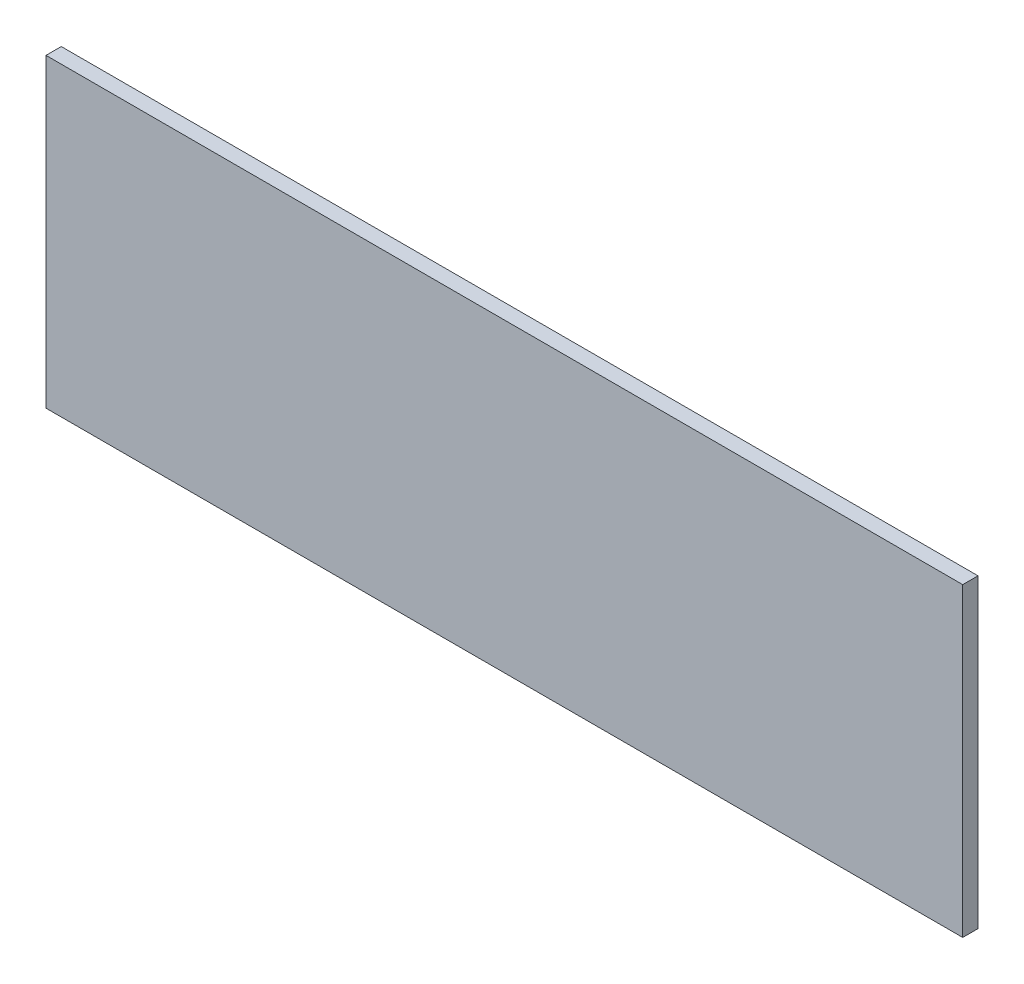
ISO-10303-21;
HEADER;
FILE_DESCRIPTION(('STEP AP214'),'2;1');
FILE_NAME('part.step','',(''),(''),'','','');
FILE_SCHEMA(('AUTOMOTIVE_DESIGN { 1 0 10303 214 1 1 1 1 }'));
ENDSEC;
DATA;
#1=APPLICATION_CONTEXT('core data for automotive mechanical design processes');
#2=APPLICATION_PROTOCOL_DEFINITION('international standard','automotive_design',2000,#1);
#3=PRODUCT_CONTEXT('',#1,'mechanical');
#4=PRODUCT('Part','Part','',(#3));
#5=PRODUCT_RELATED_PRODUCT_CATEGORY('part','',(#4));
#6=PRODUCT_DEFINITION_FORMATION('','',#4);
#7=PRODUCT_DEFINITION_CONTEXT('part definition',#1,'design');
#8=PRODUCT_DEFINITION('design','',#6,#7);
#9=PRODUCT_DEFINITION_SHAPE('','',#8);
#10=(LENGTH_UNIT() NAMED_UNIT(*) SI_UNIT(.MILLI.,.METRE.));
#11=(NAMED_UNIT(*) PLANE_ANGLE_UNIT() SI_UNIT($,.RADIAN.));
#12=(NAMED_UNIT(*) SI_UNIT($,.STERADIAN.) SOLID_ANGLE_UNIT());
#13=UNCERTAINTY_MEASURE_WITH_UNIT(LENGTH_MEASURE(1.E-05),#10,'distance_accuracy_value','');
#14=(GEOMETRIC_REPRESENTATION_CONTEXT(3) GLOBAL_UNCERTAINTY_ASSIGNED_CONTEXT((#13)) GLOBAL_UNIT_ASSIGNED_CONTEXT((#10,
#11,#12)) REPRESENTATION_CONTEXT('',''));
#15=CARTESIAN_POINT('',(0.,0.,0.));
#16=DIRECTION('',(0.,0.,1.));
#17=DIRECTION('',(1.,0.,0.));
#18=AXIS2_PLACEMENT_3D('',#15,#16,#17);
#19=CARTESIAN_POINT('',(400.,100.,10.));
#20=DIRECTION('',(-1.,0.,0.));
#21=DIRECTION('',(0.,0.,1.));
#22=AXIS2_PLACEMENT_3D('',#19,#20,#21);
#23=PLANE('',#22);
#24=DIRECTION('',(0.,1.,0.));
#25=VECTOR('',#24,1.);
#26=CARTESIAN_POINT('',(400.,100.,0.));
#27=LINE('',#26,#25);
#28=CARTESIAN_POINT('',(400.,-99.9999999999999,0.));
#29=VERTEX_POINT('',#28);
#30=CARTESIAN_POINT('',(400.,100.,0.));
#31=VERTEX_POINT('',#30);
#32=EDGE_CURVE('E91',#29,#31,#27,.T.);
#33=ORIENTED_EDGE('',*,*,#32,.T.);
#34=DIRECTION('',(0.,0.,-1.));
#35=VECTOR('',#34,1.);
#36=CARTESIAN_POINT('',(400.,100.,10.));
#37=LINE('',#36,#35);
#38=CARTESIAN_POINT('',(400.,100.,10.));
#39=VERTEX_POINT('',#38);
#40=EDGE_CURVE('E45',#39,#31,#37,.T.);
#41=ORIENTED_EDGE('',*,*,#40,.F.);
#42=DIRECTION('',(0.,1.,0.));
#43=VECTOR('',#42,1.);
#44=CARTESIAN_POINT('',(400.,100.,10.));
#45=LINE('',#44,#43);
#46=CARTESIAN_POINT('',(400.,-99.9999999999999,10.));
#47=VERTEX_POINT('',#46);
#48=EDGE_CURVE('E83',#47,#39,#45,.T.);
#49=ORIENTED_EDGE('',*,*,#48,.F.);
#50=DIRECTION('',(0.,0.,-1.));
#51=VECTOR('',#50,1.);
#52=CARTESIAN_POINT('',(400.,-99.9999999999999,10.));
#53=LINE('',#52,#51);
#54=EDGE_CURVE('E11',#47,#29,#53,.T.);
#55=ORIENTED_EDGE('',*,*,#54,.T.);
#56=EDGE_LOOP('',(#33,#41,#49,#55));
#57=FACE_BOUND('',#56,.T.);
#58=ADVANCED_FACE('F37',(#57),#23,.F.);
#59=CARTESIAN_POINT('',(-200.,100.,10.));
#60=DIRECTION('',(0.,-1.,0.));
#61=DIRECTION('',(0.,0.,-1.));
#62=AXIS2_PLACEMENT_3D('',#59,#60,#61);
#63=PLANE('',#62);
#64=DIRECTION('',(-1.,0.,0.));
#65=VECTOR('',#64,1.);
#66=CARTESIAN_POINT('',(-200.,100.,0.));
#67=LINE('',#66,#65);
#68=CARTESIAN_POINT('',(-200.,100.,0.));
#69=VERTEX_POINT('',#68);
#70=EDGE_CURVE('E70',#31,#69,#67,.T.);
#71=ORIENTED_EDGE('',*,*,#70,.T.);
#72=DIRECTION('',(0.,0.,-1.));
#73=VECTOR('',#72,1.);
#74=CARTESIAN_POINT('',(-200.,100.,10.));
#75=LINE('',#74,#73);
#76=CARTESIAN_POINT('',(-200.,100.,10.));
#77=VERTEX_POINT('',#76);
#78=EDGE_CURVE('E92',#77,#69,#75,.T.);
#79=ORIENTED_EDGE('',*,*,#78,.F.);
#80=DIRECTION('',(-1.,0.,0.));
#81=VECTOR('',#80,1.);
#82=CARTESIAN_POINT('',(200.,100.,10.));
#83=LINE('',#82,#81);
#84=EDGE_CURVE('E87',#39,#77,#83,.T.);
#85=ORIENTED_EDGE('',*,*,#84,.F.);
#86=ORIENTED_EDGE('',*,*,#40,.T.);
#87=EDGE_LOOP('',(#71,#79,#85,#86));
#88=FACE_BOUND('',#87,.T.);
#89=ADVANCED_FACE('F93',(#88),#63,.F.);
#90=CARTESIAN_POINT('',(-200.,100.,10.));
#91=DIRECTION('',(1.,0.,0.));
#92=DIRECTION('',(0.,1.,0.));
#93=AXIS2_PLACEMENT_3D('',#90,#91,#92);
#94=PLANE('',#93);
#95=DIRECTION('',(0.,-1.,0.));
#96=VECTOR('',#95,1.);
#97=CARTESIAN_POINT('',(-200.,100.,0.));
#98=LINE('',#97,#96);
#99=CARTESIAN_POINT('',(-200.,-100.,0.));
#100=VERTEX_POINT('',#99);
#101=EDGE_CURVE('E77',#69,#100,#98,.T.);
#102=ORIENTED_EDGE('',*,*,#101,.T.);
#103=DIRECTION('',(0.,0.,-1.));
#104=VECTOR('',#103,1.);
#105=CARTESIAN_POINT('',(-200.,-100.,10.));
#106=LINE('',#105,#104);
#107=CARTESIAN_POINT('',(-200.,-100.,10.));
#108=VERTEX_POINT('',#107);
#109=EDGE_CURVE('E97',#108,#100,#106,.T.);
#110=ORIENTED_EDGE('',*,*,#109,.F.);
#111=DIRECTION('',(0.,-1.,0.));
#112=VECTOR('',#111,1.);
#113=CARTESIAN_POINT('',(-200.,100.,10.));
#114=LINE('',#113,#112);
#115=EDGE_CURVE('E95',#77,#108,#114,.T.);
#116=ORIENTED_EDGE('',*,*,#115,.F.);
#117=ORIENTED_EDGE('',*,*,#78,.T.);
#118=EDGE_LOOP('',(#102,#110,#116,#117));
#119=FACE_BOUND('',#118,.T.);
#120=ADVANCED_FACE('F107',(#119),#94,.F.);
#121=CARTESIAN_POINT('',(-200.,-100.,10.));
#122=DIRECTION('',(0.,1.,0.));
#123=DIRECTION('',(0.,0.,1.));
#124=AXIS2_PLACEMENT_3D('',#121,#122,#123);
#125=PLANE('',#124);
#126=DIRECTION('',(1.,0.,0.));
#127=VECTOR('',#126,1.);
#128=CARTESIAN_POINT('',(-200.,-100.,0.));
#129=LINE('',#128,#127);
#130=EDGE_CURVE('E104',#100,#29,#129,.T.);
#131=ORIENTED_EDGE('',*,*,#130,.T.);
#132=ORIENTED_EDGE('',*,*,#54,.F.);
#133=DIRECTION('',(1.,0.,0.));
#134=VECTOR('',#133,1.);
#135=CARTESIAN_POINT('',(200.,-100.,10.));
#136=LINE('',#135,#134);
#137=EDGE_CURVE('E53',#108,#47,#136,.T.);
#138=ORIENTED_EDGE('',*,*,#137,.F.);
#139=ORIENTED_EDGE('',*,*,#109,.T.);
#140=EDGE_LOOP('',(#131,#132,#138,#139));
#141=FACE_BOUND('',#140,.T.);
#142=ADVANCED_FACE('F111',(#141),#125,.F.);
#143=CARTESIAN_POINT('',(0.,0.,10.));
#144=DIRECTION('',(0.,0.,-1.));
#145=DIRECTION('',(-1.,0.,0.));
#146=AXIS2_PLACEMENT_3D('',#143,#144,#145);
#147=PLANE('',#146);
#148=ORIENTED_EDGE('',*,*,#137,.T.);
#149=ORIENTED_EDGE('',*,*,#48,.T.);
#150=ORIENTED_EDGE('',*,*,#84,.T.);
#151=ORIENTED_EDGE('',*,*,#115,.T.);
#152=EDGE_LOOP('',(#148,#149,#150,#151));
#153=FACE_BOUND('',#152,.T.);
#154=ADVANCED_FACE('F85',(#153),#147,.F.);
#155=CARTESIAN_POINT('',(0.,0.,0.));
#156=DIRECTION('',(0.,0.,-1.));
#157=DIRECTION('',(-1.,0.,0.));
#158=AXIS2_PLACEMENT_3D('',#155,#156,#157);
#159=PLANE('',#158);
#160=ORIENTED_EDGE('',*,*,#32,.F.);
#161=ORIENTED_EDGE('',*,*,#130,.F.);
#162=ORIENTED_EDGE('',*,*,#101,.F.);
#163=ORIENTED_EDGE('',*,*,#70,.F.);
#164=EDGE_LOOP('',(#160,#161,#162,#163));
#165=FACE_BOUND('',#164,.T.);
#166=ADVANCED_FACE('F110',(#165),#159,.T.);
#167=CLOSED_SHELL('',(#58,#89,#120,#142,#154,#166));
#168=MANIFOLD_SOLID_BREP('B2',#167);
#169=ADVANCED_BREP_SHAPE_REPRESENTATION('',(#18,#168),#14);
#170=SHAPE_DEFINITION_REPRESENTATION(#9,#169);
ENDSEC;
END-ISO-10303-21;
